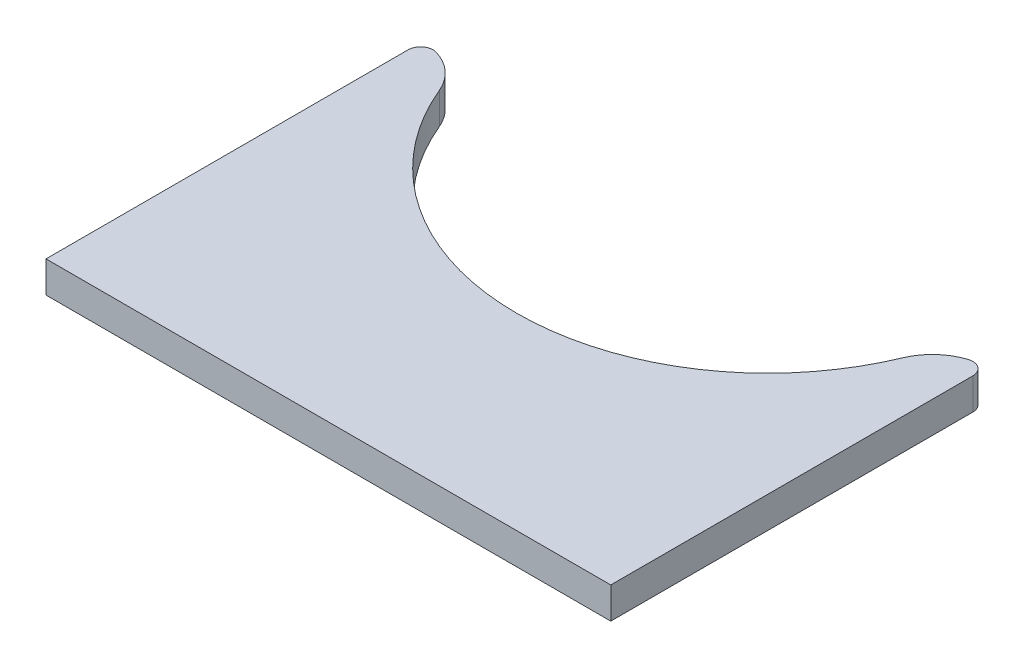
ISO-10303-21;
HEADER;
FILE_DESCRIPTION(('STEP AP214'),'2;1');
FILE_NAME('part.step','',(''),(''),'','','');
FILE_SCHEMA(('AUTOMOTIVE_DESIGN { 1 0 10303 214 1 1 1 1 }'));
ENDSEC;
DATA;
#1=APPLICATION_CONTEXT('core data for automotive mechanical design processes');
#2=APPLICATION_PROTOCOL_DEFINITION('international standard','automotive_design',2000,#1);
#3=PRODUCT_CONTEXT('',#1,'mechanical');
#4=PRODUCT('Part','Part','',(#3));
#5=PRODUCT_RELATED_PRODUCT_CATEGORY('part','',(#4));
#6=PRODUCT_DEFINITION_FORMATION('','',#4);
#7=PRODUCT_DEFINITION_CONTEXT('part definition',#1,'design');
#8=PRODUCT_DEFINITION('design','',#6,#7);
#9=PRODUCT_DEFINITION_SHAPE('','',#8);
#10=(LENGTH_UNIT() NAMED_UNIT(*) SI_UNIT(.MILLI.,.METRE.));
#11=(NAMED_UNIT(*) PLANE_ANGLE_UNIT() SI_UNIT($,.RADIAN.));
#12=(NAMED_UNIT(*) SI_UNIT($,.STERADIAN.) SOLID_ANGLE_UNIT());
#13=UNCERTAINTY_MEASURE_WITH_UNIT(LENGTH_MEASURE(1.E-05),#10,'distance_accuracy_value','');
#14=(GEOMETRIC_REPRESENTATION_CONTEXT(3) GLOBAL_UNCERTAINTY_ASSIGNED_CONTEXT((#13)) GLOBAL_UNIT_ASSIGNED_CONTEXT((#10,
#11,#12)) REPRESENTATION_CONTEXT('',''));
#15=CARTESIAN_POINT('',(0.,0.,0.));
#16=DIRECTION('',(0.,0.,1.));
#17=DIRECTION('',(1.,0.,0.));
#18=AXIS2_PLACEMENT_3D('',#15,#16,#17);
#19=CARTESIAN_POINT('',(28.575,3.175,19.05));
#20=DIRECTION('',(-1.,0.,0.));
#21=DIRECTION('',(0.,0.,-1.));
#22=AXIS2_PLACEMENT_3D('',#19,#20,#21);
#23=PLANE('',#22);
#24=DIRECTION('',(0.,0.,1.));
#25=VECTOR('',#24,1.);
#26=CARTESIAN_POINT('',(28.575,3.175,19.05));
#27=LINE('',#26,#25);
#28=CARTESIAN_POINT('',(28.575,3.175,-17.5875305342373));
#29=VERTEX_POINT('',#28);
#30=CARTESIAN_POINT('',(28.575,3.175,19.05));
#31=VERTEX_POINT('',#30);
#32=EDGE_CURVE('E137',#29,#31,#27,.T.);
#33=ORIENTED_EDGE('',*,*,#32,.T.);
#34=DIRECTION('',(0.,-1.,0.));
#35=VECTOR('',#34,1.);
#36=CARTESIAN_POINT('',(28.575,3.175,19.05));
#37=LINE('',#36,#35);
#38=CARTESIAN_POINT('',(28.575,0.,19.05));
#39=VERTEX_POINT('',#38);
#40=EDGE_CURVE('E155',#31,#39,#37,.T.);
#41=ORIENTED_EDGE('',*,*,#40,.T.);
#42=DIRECTION('',(0.,0.,1.));
#43=VECTOR('',#42,1.);
#44=CARTESIAN_POINT('',(28.575,0.,19.05));
#45=LINE('',#44,#43);
#46=CARTESIAN_POINT('',(28.575,0.,-17.5875305342373));
#47=VERTEX_POINT('',#46);
#48=EDGE_CURVE('E112',#47,#39,#45,.T.);
#49=ORIENTED_EDGE('',*,*,#48,.F.);
#50=DIRECTION('',(0.,1.,0.));
#51=VECTOR('',#50,1.);
#52=CARTESIAN_POINT('',(28.575,3.175,-17.5875305342373));
#53=LINE('',#52,#51);
#54=EDGE_CURVE('E158',#29,#47,#53,.F.);
#55=ORIENTED_EDGE('',*,*,#54,.F.);
#56=EDGE_LOOP('',(#33,#41,#49,#55));
#57=FACE_BOUND('',#56,.T.);
#58=ADVANCED_FACE('F41',(#57),#23,.F.);
#59=CARTESIAN_POINT('',(-28.575,3.175,19.05));
#60=DIRECTION('',(0.,0.,-1.));
#61=DIRECTION('',(1.,0.,0.));
#62=AXIS2_PLACEMENT_3D('',#59,#60,#61);
#63=PLANE('',#62);
#64=DIRECTION('',(-1.,0.,0.));
#65=VECTOR('',#64,1.);
#66=CARTESIAN_POINT('',(-28.575,0.,19.05));
#67=LINE('',#66,#65);
#68=CARTESIAN_POINT('',(-28.575,0.,19.05));
#69=VERTEX_POINT('',#68);
#70=EDGE_CURVE('E149',#39,#69,#67,.T.);
#71=ORIENTED_EDGE('',*,*,#70,.F.);
#72=ORIENTED_EDGE('',*,*,#40,.F.);
#73=DIRECTION('',(-1.,0.,0.));
#74=VECTOR('',#73,1.);
#75=CARTESIAN_POINT('',(-28.575,3.175,19.05));
#76=LINE('',#75,#74);
#77=CARTESIAN_POINT('',(-28.575,3.175,19.05));
#78=VERTEX_POINT('',#77);
#79=EDGE_CURVE('E140',#31,#78,#76,.T.);
#80=ORIENTED_EDGE('',*,*,#79,.T.);
#81=DIRECTION('',(0.,-1.,0.));
#82=VECTOR('',#81,1.);
#83=CARTESIAN_POINT('',(-28.575,3.175,19.05));
#84=LINE('',#83,#82);
#85=EDGE_CURVE('E147',#78,#69,#84,.T.);
#86=ORIENTED_EDGE('',*,*,#85,.T.);
#87=EDGE_LOOP('',(#71,#72,#80,#86));
#88=FACE_BOUND('',#87,.T.);
#89=ADVANCED_FACE('F184',(#88),#63,.F.);
#90=CARTESIAN_POINT('',(-28.575,3.175,19.05));
#91=DIRECTION('',(1.,0.,0.));
#92=DIRECTION('',(0.,0.,1.));
#93=AXIS2_PLACEMENT_3D('',#90,#91,#92);
#94=PLANE('',#93);
#95=DIRECTION('',(0.,0.,-1.));
#96=VECTOR('',#95,1.);
#97=CARTESIAN_POINT('',(-28.575,0.,19.05));
#98=LINE('',#97,#96);
#99=CARTESIAN_POINT('',(-28.575,0.,-17.5875305342373));
#100=VERTEX_POINT('',#99);
#101=EDGE_CURVE('E141',#69,#100,#98,.T.);
#102=ORIENTED_EDGE('',*,*,#101,.F.);
#103=ORIENTED_EDGE('',*,*,#85,.F.);
#104=DIRECTION('',(0.,0.,-1.));
#105=VECTOR('',#104,1.);
#106=CARTESIAN_POINT('',(-28.575,3.175,19.05));
#107=LINE('',#106,#105);
#108=CARTESIAN_POINT('',(-28.575,3.175,-17.5875305342373));
#109=VERTEX_POINT('',#108);
#110=EDGE_CURVE('E144',#78,#109,#107,.T.);
#111=ORIENTED_EDGE('',*,*,#110,.T.);
#112=DIRECTION('',(0.,1.,0.));
#113=VECTOR('',#112,1.);
#114=CARTESIAN_POINT('',(-28.575,3.175,-17.5875305342373));
#115=LINE('',#114,#113);
#116=EDGE_CURVE('E11',#100,#109,#115,.T.);
#117=ORIENTED_EDGE('',*,*,#116,.F.);
#118=EDGE_LOOP('',(#102,#103,#111,#117));
#119=FACE_BOUND('',#118,.T.);
#120=ADVANCED_FACE('F187',(#119),#94,.F.);
#121=CARTESIAN_POINT('',(0.,3.175,0.));
#122=DIRECTION('',(0.,1.,0.));
#123=DIRECTION('',(0.,0.,-1.));
#124=AXIS2_PLACEMENT_3D('',#121,#122,#123);
#125=PLANE('',#124);
#126=CARTESIAN_POINT('',(28.575,3.175,-13.49375));
#127=DIRECTION('',(0.,1.,0.));
#128=DIRECTION('',(0.,0.,-1.));
#129=AXIS2_PLACEMENT_3D('',#126,#127,#128);
#130=CIRCLE('',#129,5.55625000000001);
#131=CARTESIAN_POINT('',(26.9287037037037,3.175,-18.8005025443816));
#132=VERTEX_POINT('',#131);
#133=CARTESIAN_POINT('',(23.4461538461538,3.175,-15.6307692307692));
#134=VERTEX_POINT('',#133);
#135=EDGE_CURVE('E130',#132,#134,#130,.T.);
#136=ORIENTED_EDGE('',*,*,#135,.T.);
#137=CARTESIAN_POINT('',(0.,3.175,-25.4));
#138=DIRECTION('',(0.,-1.,0.));
#139=DIRECTION('',(0.,0.,1.));
#140=AXIS2_PLACEMENT_3D('',#137,#138,#139);
#141=CIRCLE('',#140,25.4);
#142=CARTESIAN_POINT('',(-23.4461538461539,3.175,-15.6307692307692));
#143=VERTEX_POINT('',#142);
#144=EDGE_CURVE('E127',#134,#143,#141,.T.);
#145=ORIENTED_EDGE('',*,*,#144,.T.);
#146=CARTESIAN_POINT('',(-28.575,3.175,-13.49375));
#147=DIRECTION('',(0.,1.,0.));
#148=DIRECTION('',(0.,0.,-1.));
#149=AXIS2_PLACEMENT_3D('',#146,#147,#148);
#150=CIRCLE('',#149,5.55624999999999);
#151=CARTESIAN_POINT('',(-26.9287037037037,3.175,-18.8005025443816));
#152=VERTEX_POINT('',#151);
#153=EDGE_CURVE('E108',#143,#152,#150,.T.);
#154=ORIENTED_EDGE('',*,*,#153,.T.);
#155=CARTESIAN_POINT('',(-27.305,3.175,-17.5875305342373));
#156=DIRECTION('',(0.,-1.,0.));
#157=DIRECTION('',(0.,0.,-1.));
#158=AXIS2_PLACEMENT_3D('',#155,#156,#157);
#159=CIRCLE('',#158,1.27);
#160=EDGE_CURVE('E56',#109,#152,#159,.T.);
#161=ORIENTED_EDGE('',*,*,#160,.F.);
#162=ORIENTED_EDGE('',*,*,#110,.F.);
#163=ORIENTED_EDGE('',*,*,#79,.F.);
#164=ORIENTED_EDGE('',*,*,#32,.F.);
#165=CARTESIAN_POINT('',(27.305,3.175,-17.5875305342373));
#166=DIRECTION('',(0.,-1.,0.));
#167=DIRECTION('',(0.,0.,-1.));
#168=AXIS2_PLACEMENT_3D('',#165,#166,#167);
#169=CIRCLE('',#168,1.27);
#170=EDGE_CURVE('E168',#132,#29,#169,.T.);
#171=ORIENTED_EDGE('',*,*,#170,.F.);
#172=EDGE_LOOP('',(#136,#145,#154,#161,#162,#163,#164,#171));
#173=FACE_BOUND('',#172,.T.);
#174=ADVANCED_FACE('F171',(#173),#125,.T.);
#175=CARTESIAN_POINT('',(0.,0.,0.));
#176=DIRECTION('',(0.,1.,0.));
#177=DIRECTION('',(0.,0.,-1.));
#178=AXIS2_PLACEMENT_3D('',#175,#176,#177);
#179=PLANE('',#178);
#180=ORIENTED_EDGE('',*,*,#48,.T.);
#181=ORIENTED_EDGE('',*,*,#70,.T.);
#182=ORIENTED_EDGE('',*,*,#101,.T.);
#183=CARTESIAN_POINT('',(-27.305,0.,-17.5875305342373));
#184=DIRECTION('',(0.,-1.,0.));
#185=DIRECTION('',(0.,0.,-1.));
#186=AXIS2_PLACEMENT_3D('',#183,#184,#185);
#187=CIRCLE('',#186,1.27);
#188=CARTESIAN_POINT('',(-26.9287037037037,0.,-18.8005025443816));
#189=VERTEX_POINT('',#188);
#190=EDGE_CURVE('E126',#189,#100,#187,.F.);
#191=ORIENTED_EDGE('',*,*,#190,.F.);
#192=CARTESIAN_POINT('',(-28.575,0.,-13.49375));
#193=DIRECTION('',(0.,1.,0.));
#194=DIRECTION('',(0.,0.,-1.));
#195=AXIS2_PLACEMENT_3D('',#192,#193,#194);
#196=CIRCLE('',#195,5.55624999999999);
#197=CARTESIAN_POINT('',(-23.4461538461539,0.,-15.6307692307692));
#198=VERTEX_POINT('',#197);
#199=EDGE_CURVE('E106',#198,#189,#196,.T.);
#200=ORIENTED_EDGE('',*,*,#199,.F.);
#201=CARTESIAN_POINT('',(0.,0.,-25.4));
#202=DIRECTION('',(0.,-1.,0.));
#203=DIRECTION('',(0.,0.,1.));
#204=AXIS2_PLACEMENT_3D('',#201,#202,#203);
#205=CIRCLE('',#204,25.4);
#206=CARTESIAN_POINT('',(23.4461538461538,0.,-15.6307692307692));
#207=VERTEX_POINT('',#206);
#208=EDGE_CURVE('E116',#207,#198,#205,.T.);
#209=ORIENTED_EDGE('',*,*,#208,.F.);
#210=CARTESIAN_POINT('',(28.575,0.,-13.49375));
#211=DIRECTION('',(0.,1.,0.));
#212=DIRECTION('',(0.,0.,-1.));
#213=AXIS2_PLACEMENT_3D('',#210,#211,#212);
#214=CIRCLE('',#213,5.55625000000001);
#215=CARTESIAN_POINT('',(26.9287037037037,0.,-18.8005025443816));
#216=VERTEX_POINT('',#215);
#217=EDGE_CURVE('E121',#216,#207,#214,.T.);
#218=ORIENTED_EDGE('',*,*,#217,.F.);
#219=CARTESIAN_POINT('',(27.305,0.,-17.5875305342373));
#220=DIRECTION('',(0.,-1.,0.));
#221=DIRECTION('',(0.,0.,-1.));
#222=AXIS2_PLACEMENT_3D('',#219,#220,#221);
#223=CIRCLE('',#222,1.27);
#224=EDGE_CURVE('E162',#47,#216,#223,.F.);
#225=ORIENTED_EDGE('',*,*,#224,.F.);
#226=EDGE_LOOP('',(#180,#181,#182,#191,#200,#209,#218,#225));
#227=FACE_BOUND('',#226,.T.);
#228=ADVANCED_FACE('F124',(#227),#179,.F.);
#229=CARTESIAN_POINT('',(-28.575,0.,-13.49375));
#230=DIRECTION('',(0.,1.,0.));
#231=DIRECTION('',(0.,0.,-1.));
#232=AXIS2_PLACEMENT_3D('',#229,#230,#231);
#233=CYLINDRICAL_SURFACE('',#232,5.55624999999999);
#234=ORIENTED_EDGE('',*,*,#153,.F.);
#235=DIRECTION('',(0.,1.,0.));
#236=VECTOR('',#235,1.);
#237=CARTESIAN_POINT('',(-23.4461538461539,0.,-15.6307692307692));
#238=LINE('',#237,#236);
#239=EDGE_CURVE('E102',#198,#143,#238,.T.);
#240=ORIENTED_EDGE('',*,*,#239,.F.);
#241=ORIENTED_EDGE('',*,*,#199,.T.);
#242=DIRECTION('',(0.,1.,0.));
#243=VECTOR('',#242,1.);
#244=CARTESIAN_POINT('',(-26.9287037037037,0.,-18.8005025443816));
#245=LINE('',#244,#243);
#246=EDGE_CURVE('E49',#152,#189,#245,.F.);
#247=ORIENTED_EDGE('',*,*,#246,.F.);
#248=EDGE_LOOP('',(#234,#240,#241,#247));
#249=FACE_BOUND('',#248,.T.);
#250=ADVANCED_FACE('F104',(#249),#233,.T.);
#251=CARTESIAN_POINT('',(0.,0.,-25.4));
#252=DIRECTION('',(0.,1.,0.));
#253=DIRECTION('',(0.,0.,-1.));
#254=AXIS2_PLACEMENT_3D('',#251,#252,#253);
#255=CYLINDRICAL_SURFACE('',#254,25.4);
#256=ORIENTED_EDGE('',*,*,#144,.F.);
#257=DIRECTION('',(0.,1.,0.));
#258=VECTOR('',#257,1.);
#259=CARTESIAN_POINT('',(23.4461538461538,0.,-15.6307692307692));
#260=LINE('',#259,#258);
#261=EDGE_CURVE('E113',#207,#134,#260,.T.);
#262=ORIENTED_EDGE('',*,*,#261,.F.);
#263=ORIENTED_EDGE('',*,*,#208,.T.);
#264=ORIENTED_EDGE('',*,*,#239,.T.);
#265=EDGE_LOOP('',(#256,#262,#263,#264));
#266=FACE_BOUND('',#265,.T.);
#267=ADVANCED_FACE('F117',(#266),#255,.F.);
#268=CARTESIAN_POINT('',(28.575,0.,-13.49375));
#269=DIRECTION('',(0.,1.,0.));
#270=DIRECTION('',(0.,0.,-1.));
#271=AXIS2_PLACEMENT_3D('',#268,#269,#270);
#272=CYLINDRICAL_SURFACE('',#271,5.55625000000001);
#273=ORIENTED_EDGE('',*,*,#217,.T.);
#274=ORIENTED_EDGE('',*,*,#261,.T.);
#275=ORIENTED_EDGE('',*,*,#135,.F.);
#276=DIRECTION('',(0.,1.,0.));
#277=VECTOR('',#276,1.);
#278=CARTESIAN_POINT('',(26.9287037037037,0.,-18.8005025443816));
#279=LINE('',#278,#277);
#280=EDGE_CURVE('E165',#216,#132,#279,.T.);
#281=ORIENTED_EDGE('',*,*,#280,.F.);
#282=EDGE_LOOP('',(#273,#274,#275,#281));
#283=FACE_BOUND('',#282,.T.);
#284=ADVANCED_FACE('F176',(#283),#272,.T.);
#285=CARTESIAN_POINT('',(27.305,0.,-17.5875305342373));
#286=DIRECTION('',(0.,1.,0.));
#287=DIRECTION('',(0.,0.,-1.));
#288=AXIS2_PLACEMENT_3D('',#285,#286,#287);
#289=CYLINDRICAL_SURFACE('',#288,1.27);
#290=ORIENTED_EDGE('',*,*,#170,.T.);
#291=ORIENTED_EDGE('',*,*,#54,.T.);
#292=ORIENTED_EDGE('',*,*,#224,.T.);
#293=ORIENTED_EDGE('',*,*,#280,.T.);
#294=EDGE_LOOP('',(#290,#291,#292,#293));
#295=FACE_BOUND('',#294,.T.);
#296=ADVANCED_FACE('F180',(#295),#289,.T.);
#297=CARTESIAN_POINT('',(-27.305,0.,-17.5875305342373));
#298=DIRECTION('',(0.,1.,0.));
#299=DIRECTION('',(0.,0.,-1.));
#300=AXIS2_PLACEMENT_3D('',#297,#298,#299);
#301=CYLINDRICAL_SURFACE('',#300,1.27);
#302=ORIENTED_EDGE('',*,*,#160,.T.);
#303=ORIENTED_EDGE('',*,*,#246,.T.);
#304=ORIENTED_EDGE('',*,*,#190,.T.);
#305=ORIENTED_EDGE('',*,*,#116,.T.);
#306=EDGE_LOOP('',(#302,#303,#304,#305));
#307=FACE_BOUND('',#306,.T.);
#308=ADVANCED_FACE('F43',(#307),#301,.T.);
#309=CLOSED_SHELL('',(#58,#89,#120,#174,#228,#250,#267,#284,#296,#308));
#310=MANIFOLD_SOLID_BREP('B2',#309);
#311=ADVANCED_BREP_SHAPE_REPRESENTATION('',(#18,#310),#14);
#312=SHAPE_DEFINITION_REPRESENTATION(#9,#311);
ENDSEC;
END-ISO-10303-21;
